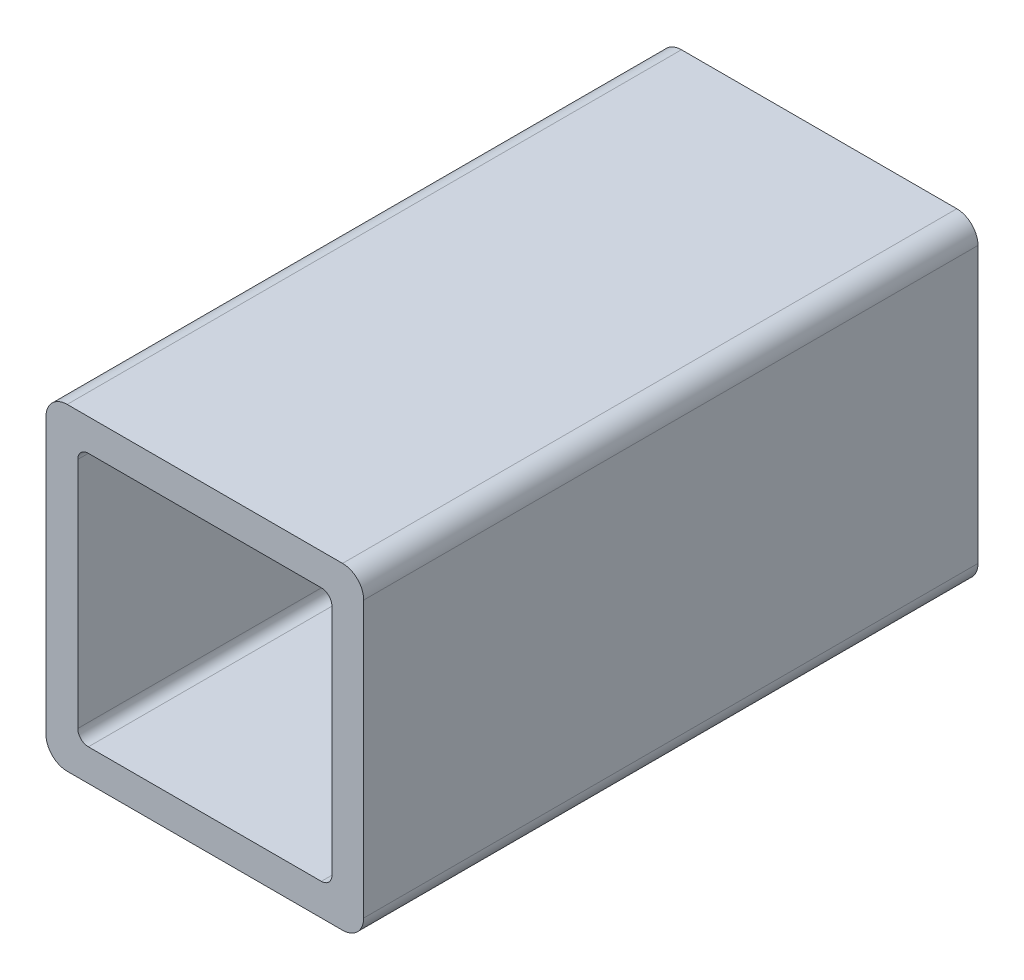
ISO-10303-21;
HEADER;
FILE_DESCRIPTION(('STEP AP214'),'2;1');
FILE_NAME('part.step','',(''),(''),'','','');
FILE_SCHEMA(('AUTOMOTIVE_DESIGN { 1 0 10303 214 1 1 1 1 }'));
ENDSEC;
DATA;
#1=APPLICATION_CONTEXT('core data for automotive mechanical design processes');
#2=APPLICATION_PROTOCOL_DEFINITION('international standard','automotive_design',2000,#1);
#3=PRODUCT_CONTEXT('',#1,'mechanical');
#4=PRODUCT('Part','Part','',(#3));
#5=PRODUCT_RELATED_PRODUCT_CATEGORY('part','',(#4));
#6=PRODUCT_DEFINITION_FORMATION('','',#4);
#7=PRODUCT_DEFINITION_CONTEXT('part definition',#1,'design');
#8=PRODUCT_DEFINITION('design','',#6,#7);
#9=PRODUCT_DEFINITION_SHAPE('','',#8);
#10=(LENGTH_UNIT() NAMED_UNIT(*) SI_UNIT(.MILLI.,.METRE.));
#11=(NAMED_UNIT(*) PLANE_ANGLE_UNIT() SI_UNIT($,.RADIAN.));
#12=(NAMED_UNIT(*) SI_UNIT($,.STERADIAN.) SOLID_ANGLE_UNIT());
#13=UNCERTAINTY_MEASURE_WITH_UNIT(LENGTH_MEASURE(1.E-05),#10,'distance_accuracy_value','');
#14=(GEOMETRIC_REPRESENTATION_CONTEXT(3) GLOBAL_UNCERTAINTY_ASSIGNED_CONTEXT((#13)) GLOBAL_UNIT_ASSIGNED_CONTEXT((#10,
#11,#12)) REPRESENTATION_CONTEXT('',''));
#15=CARTESIAN_POINT('',(0.,0.,0.));
#16=DIRECTION('',(0.,0.,1.));
#17=DIRECTION('',(1.,0.,0.));
#18=AXIS2_PLACEMENT_3D('',#15,#16,#17);
#19=CARTESIAN_POINT('',(2.,2.,58.));
#20=DIRECTION('',(0.,0.,1.));
#21=DIRECTION('',(1.,0.,0.));
#22=AXIS2_PLACEMENT_3D('',#19,#20,#21);
#23=PLANE('',#22);
#24=CARTESIAN_POINT('',(2.,2.,58.));
#25=DIRECTION('',(0.,0.,1.));
#26=DIRECTION('',(1.,0.,0.));
#27=AXIS2_PLACEMENT_3D('',#24,#25,#26);
#28=CIRCLE('',#27,2.);
#29=CARTESIAN_POINT('',(0.,2.00000000000001,58.));
#30=VERTEX_POINT('',#29);
#31=CARTESIAN_POINT('',(2.00000000000001,0.,58.));
#32=VERTEX_POINT('',#31);
#33=EDGE_CURVE('E214',#30,#32,#28,.T.);
#34=ORIENTED_EDGE('',*,*,#33,.T.);
#35=DIRECTION('',(1.,0.,0.));
#36=VECTOR('',#35,1.);
#37=CARTESIAN_POINT('',(2.00000000000001,0.,58.));
#38=LINE('',#37,#36);
#39=CARTESIAN_POINT('',(28.,0.,58.));
#40=VERTEX_POINT('',#39);
#41=EDGE_CURVE('E217',#32,#40,#38,.T.);
#42=ORIENTED_EDGE('',*,*,#41,.T.);
#43=CARTESIAN_POINT('',(28.,2.,58.));
#44=DIRECTION('',(0.,0.,1.));
#45=DIRECTION('',(1.,0.,0.));
#46=AXIS2_PLACEMENT_3D('',#43,#44,#45);
#47=CIRCLE('',#46,2.);
#48=CARTESIAN_POINT('',(30.,2.00000000000001,58.));
#49=VERTEX_POINT('',#48);
#50=EDGE_CURVE('E220',#40,#49,#47,.T.);
#51=ORIENTED_EDGE('',*,*,#50,.T.);
#52=DIRECTION('',(0.,1.,0.));
#53=VECTOR('',#52,1.);
#54=CARTESIAN_POINT('',(30.,2.00000000000001,58.));
#55=LINE('',#54,#53);
#56=CARTESIAN_POINT('',(30.,28.,58.));
#57=VERTEX_POINT('',#56);
#58=EDGE_CURVE('E222',#49,#57,#55,.T.);
#59=ORIENTED_EDGE('',*,*,#58,.T.);
#60=CARTESIAN_POINT('',(28.,28.,58.));
#61=DIRECTION('',(0.,0.,1.));
#62=DIRECTION('',(1.,0.,0.));
#63=AXIS2_PLACEMENT_3D('',#60,#61,#62);
#64=CIRCLE('',#63,2.);
#65=CARTESIAN_POINT('',(28.,30.,58.));
#66=VERTEX_POINT('',#65);
#67=EDGE_CURVE('E224',#57,#66,#64,.T.);
#68=ORIENTED_EDGE('',*,*,#67,.T.);
#69=DIRECTION('',(-1.,0.,0.));
#70=VECTOR('',#69,1.);
#71=CARTESIAN_POINT('',(2.00000000000001,30.,58.));
#72=LINE('',#71,#70);
#73=CARTESIAN_POINT('',(2.00000000000001,30.,58.));
#74=VERTEX_POINT('',#73);
#75=EDGE_CURVE('E226',#66,#74,#72,.T.);
#76=ORIENTED_EDGE('',*,*,#75,.T.);
#77=CARTESIAN_POINT('',(2.,28.,58.));
#78=DIRECTION('',(0.,0.,1.));
#79=DIRECTION('',(1.,0.,0.));
#80=AXIS2_PLACEMENT_3D('',#77,#78,#79);
#81=CIRCLE('',#80,2.);
#82=CARTESIAN_POINT('',(0.,28.,58.));
#83=VERTEX_POINT('',#82);
#84=EDGE_CURVE('E228',#74,#83,#81,.T.);
#85=ORIENTED_EDGE('',*,*,#84,.T.);
#86=DIRECTION('',(0.,-1.,0.));
#87=VECTOR('',#86,1.);
#88=CARTESIAN_POINT('',(0.,2.00000000000001,58.));
#89=LINE('',#88,#87);
#90=EDGE_CURVE('E230',#83,#30,#89,.T.);
#91=ORIENTED_EDGE('',*,*,#90,.T.);
#92=EDGE_LOOP('',(#34,#42,#51,#59,#68,#76,#85,#91));
#93=FACE_BOUND('',#92,.T.);
#94=DIRECTION('',(1.,0.,0.));
#95=VECTOR('',#94,1.);
#96=CARTESIAN_POINT('',(4.00000000000001,3.,58.));
#97=LINE('',#96,#95);
#98=CARTESIAN_POINT('',(4.00000000000001,3.,58.));
#99=VERTEX_POINT('',#98);
#100=CARTESIAN_POINT('',(26.,3.,58.));
#101=VERTEX_POINT('',#100);
#102=EDGE_CURVE('E157',#99,#101,#97,.T.);
#103=ORIENTED_EDGE('',*,*,#102,.F.);
#104=CARTESIAN_POINT('',(4.,4.,58.));
#105=DIRECTION('',(0.,0.,1.));
#106=DIRECTION('',(1.,0.,0.));
#107=AXIS2_PLACEMENT_3D('',#104,#105,#106);
#108=CIRCLE('',#107,1.);
#109=CARTESIAN_POINT('',(3.,4.00000000000001,58.));
#110=VERTEX_POINT('',#109);
#111=EDGE_CURVE('E149',#110,#99,#108,.T.);
#112=ORIENTED_EDGE('',*,*,#111,.F.);
#113=DIRECTION('',(0.,-1.,0.));
#114=VECTOR('',#113,1.);
#115=CARTESIAN_POINT('',(3.,4.00000000000001,58.));
#116=LINE('',#115,#114);
#117=CARTESIAN_POINT('',(3.,26.,58.));
#118=VERTEX_POINT('',#117);
#119=EDGE_CURVE('E182',#118,#110,#116,.T.);
#120=ORIENTED_EDGE('',*,*,#119,.F.);
#121=CARTESIAN_POINT('',(4.,26.,58.));
#122=DIRECTION('',(0.,0.,1.));
#123=DIRECTION('',(1.,0.,0.));
#124=AXIS2_PLACEMENT_3D('',#121,#122,#123);
#125=CIRCLE('',#124,1.);
#126=CARTESIAN_POINT('',(4.00000000000001,27.,58.));
#127=VERTEX_POINT('',#126);
#128=EDGE_CURVE('E180',#127,#118,#125,.T.);
#129=ORIENTED_EDGE('',*,*,#128,.F.);
#130=DIRECTION('',(-1.,0.,0.));
#131=VECTOR('',#130,1.);
#132=CARTESIAN_POINT('',(4.00000000000001,27.,58.));
#133=LINE('',#132,#131);
#134=CARTESIAN_POINT('',(26.,27.,58.));
#135=VERTEX_POINT('',#134);
#136=EDGE_CURVE('E178',#135,#127,#133,.T.);
#137=ORIENTED_EDGE('',*,*,#136,.F.);
#138=CARTESIAN_POINT('',(26.,26.,58.));
#139=DIRECTION('',(0.,0.,1.));
#140=DIRECTION('',(1.,0.,0.));
#141=AXIS2_PLACEMENT_3D('',#138,#139,#140);
#142=CIRCLE('',#141,1.);
#143=CARTESIAN_POINT('',(27.,26.,58.));
#144=VERTEX_POINT('',#143);
#145=EDGE_CURVE('E176',#144,#135,#142,.T.);
#146=ORIENTED_EDGE('',*,*,#145,.F.);
#147=DIRECTION('',(0.,1.,0.));
#148=VECTOR('',#147,1.);
#149=CARTESIAN_POINT('',(27.,4.00000000000001,58.));
#150=LINE('',#149,#148);
#151=CARTESIAN_POINT('',(27.,4.00000000000001,58.));
#152=VERTEX_POINT('',#151);
#153=EDGE_CURVE('E172',#152,#144,#150,.T.);
#154=ORIENTED_EDGE('',*,*,#153,.F.);
#155=CARTESIAN_POINT('',(26.,4.,58.));
#156=DIRECTION('',(0.,0.,1.));
#157=DIRECTION('',(1.,0.,0.));
#158=AXIS2_PLACEMENT_3D('',#155,#156,#157);
#159=CIRCLE('',#158,1.);
#160=EDGE_CURVE('E170',#101,#152,#159,.T.);
#161=ORIENTED_EDGE('',*,*,#160,.F.);
#162=EDGE_LOOP('',(#103,#112,#120,#129,#137,#146,#154,#161));
#163=FACE_BOUND('',#162,.T.);
#164=ADVANCED_FACE('F36',(#93,#163),#23,.T.);
#165=CARTESIAN_POINT('',(2.,2.,0.));
#166=DIRECTION('',(0.,0.,1.));
#167=DIRECTION('',(1.,0.,0.));
#168=AXIS2_PLACEMENT_3D('',#165,#166,#167);
#169=PLANE('',#168);
#170=CARTESIAN_POINT('',(2.,2.,0.));
#171=DIRECTION('',(0.,0.,1.));
#172=DIRECTION('',(1.,0.,0.));
#173=AXIS2_PLACEMENT_3D('',#170,#171,#172);
#174=CIRCLE('',#173,2.);
#175=CARTESIAN_POINT('',(0.,2.00000000000001,0.));
#176=VERTEX_POINT('',#175);
#177=CARTESIAN_POINT('',(2.00000000000001,0.,0.));
#178=VERTEX_POINT('',#177);
#179=EDGE_CURVE('E165',#176,#178,#174,.T.);
#180=ORIENTED_EDGE('',*,*,#179,.F.);
#181=DIRECTION('',(0.,-1.,0.));
#182=VECTOR('',#181,1.);
#183=CARTESIAN_POINT('',(0.,2.00000000000001,0.));
#184=LINE('',#183,#182);
#185=CARTESIAN_POINT('',(0.,28.,0.));
#186=VERTEX_POINT('',#185);
#187=EDGE_CURVE('E218',#186,#176,#184,.T.);
#188=ORIENTED_EDGE('',*,*,#187,.F.);
#189=CARTESIAN_POINT('',(2.,28.,0.));
#190=DIRECTION('',(0.,0.,1.));
#191=DIRECTION('',(1.,0.,0.));
#192=AXIS2_PLACEMENT_3D('',#189,#190,#191);
#193=CIRCLE('',#192,2.);
#194=CARTESIAN_POINT('',(2.00000000000001,30.,0.));
#195=VERTEX_POINT('',#194);
#196=EDGE_CURVE('E245',#195,#186,#193,.T.);
#197=ORIENTED_EDGE('',*,*,#196,.F.);
#198=DIRECTION('',(-1.,0.,0.));
#199=VECTOR('',#198,1.);
#200=CARTESIAN_POINT('',(2.00000000000001,30.,0.));
#201=LINE('',#200,#199);
#202=CARTESIAN_POINT('',(28.,30.,0.));
#203=VERTEX_POINT('',#202);
#204=EDGE_CURVE('E243',#203,#195,#201,.T.);
#205=ORIENTED_EDGE('',*,*,#204,.F.);
#206=CARTESIAN_POINT('',(28.,28.,0.));
#207=DIRECTION('',(0.,0.,1.));
#208=DIRECTION('',(1.,0.,0.));
#209=AXIS2_PLACEMENT_3D('',#206,#207,#208);
#210=CIRCLE('',#209,2.);
#211=CARTESIAN_POINT('',(30.,28.,0.));
#212=VERTEX_POINT('',#211);
#213=EDGE_CURVE('E241',#212,#203,#210,.T.);
#214=ORIENTED_EDGE('',*,*,#213,.F.);
#215=DIRECTION('',(0.,1.,0.));
#216=VECTOR('',#215,1.);
#217=CARTESIAN_POINT('',(30.,2.00000000000001,0.));
#218=LINE('',#217,#216);
#219=CARTESIAN_POINT('',(30.,2.00000000000001,0.));
#220=VERTEX_POINT('',#219);
#221=EDGE_CURVE('E239',#220,#212,#218,.T.);
#222=ORIENTED_EDGE('',*,*,#221,.F.);
#223=CARTESIAN_POINT('',(28.,2.,0.));
#224=DIRECTION('',(0.,0.,1.));
#225=DIRECTION('',(1.,0.,0.));
#226=AXIS2_PLACEMENT_3D('',#223,#224,#225);
#227=CIRCLE('',#226,2.);
#228=CARTESIAN_POINT('',(28.,0.,0.));
#229=VERTEX_POINT('',#228);
#230=EDGE_CURVE('E237',#229,#220,#227,.T.);
#231=ORIENTED_EDGE('',*,*,#230,.F.);
#232=DIRECTION('',(1.,0.,0.));
#233=VECTOR('',#232,1.);
#234=CARTESIAN_POINT('',(2.00000000000001,0.,0.));
#235=LINE('',#234,#233);
#236=EDGE_CURVE('E235',#178,#229,#235,.T.);
#237=ORIENTED_EDGE('',*,*,#236,.F.);
#238=EDGE_LOOP('',(#180,#188,#197,#205,#214,#222,#231,#237));
#239=FACE_BOUND('',#238,.T.);
#240=CARTESIAN_POINT('',(4.,4.,0.));
#241=DIRECTION('',(0.,0.,1.));
#242=DIRECTION('',(1.,0.,0.));
#243=AXIS2_PLACEMENT_3D('',#240,#241,#242);
#244=CIRCLE('',#243,1.);
#245=CARTESIAN_POINT('',(3.,4.00000000000001,0.));
#246=VERTEX_POINT('',#245);
#247=CARTESIAN_POINT('',(4.00000000000001,3.,0.));
#248=VERTEX_POINT('',#247);
#249=EDGE_CURVE('E59',#246,#248,#244,.T.);
#250=ORIENTED_EDGE('',*,*,#249,.T.);
#251=DIRECTION('',(1.,0.,0.));
#252=VECTOR('',#251,1.);
#253=CARTESIAN_POINT('',(4.00000000000001,3.,0.));
#254=LINE('',#253,#252);
#255=CARTESIAN_POINT('',(26.,3.,0.));
#256=VERTEX_POINT('',#255);
#257=EDGE_CURVE('E164',#248,#256,#254,.T.);
#258=ORIENTED_EDGE('',*,*,#257,.T.);
#259=CARTESIAN_POINT('',(26.,4.,0.));
#260=DIRECTION('',(0.,0.,1.));
#261=DIRECTION('',(1.,0.,0.));
#262=AXIS2_PLACEMENT_3D('',#259,#260,#261);
#263=CIRCLE('',#262,1.);
#264=CARTESIAN_POINT('',(27.,4.00000000000001,0.));
#265=VERTEX_POINT('',#264);
#266=EDGE_CURVE('E186',#256,#265,#263,.T.);
#267=ORIENTED_EDGE('',*,*,#266,.T.);
#268=DIRECTION('',(0.,1.,0.));
#269=VECTOR('',#268,1.);
#270=CARTESIAN_POINT('',(27.,4.00000000000001,0.));
#271=LINE('',#270,#269);
#272=CARTESIAN_POINT('',(27.,26.,0.));
#273=VERTEX_POINT('',#272);
#274=EDGE_CURVE('E189',#265,#273,#271,.T.);
#275=ORIENTED_EDGE('',*,*,#274,.T.);
#276=CARTESIAN_POINT('',(26.,26.,0.));
#277=DIRECTION('',(0.,0.,1.));
#278=DIRECTION('',(1.,0.,0.));
#279=AXIS2_PLACEMENT_3D('',#276,#277,#278);
#280=CIRCLE('',#279,1.);
#281=CARTESIAN_POINT('',(26.,27.,0.));
#282=VERTEX_POINT('',#281);
#283=EDGE_CURVE('E192',#273,#282,#280,.T.);
#284=ORIENTED_EDGE('',*,*,#283,.T.);
#285=DIRECTION('',(-1.,0.,0.));
#286=VECTOR('',#285,1.);
#287=CARTESIAN_POINT('',(4.00000000000001,27.,0.));
#288=LINE('',#287,#286);
#289=CARTESIAN_POINT('',(4.00000000000001,27.,0.));
#290=VERTEX_POINT('',#289);
#291=EDGE_CURVE('E195',#282,#290,#288,.T.);
#292=ORIENTED_EDGE('',*,*,#291,.T.);
#293=CARTESIAN_POINT('',(4.,26.,0.));
#294=DIRECTION('',(0.,0.,1.));
#295=DIRECTION('',(1.,0.,0.));
#296=AXIS2_PLACEMENT_3D('',#293,#294,#295);
#297=CIRCLE('',#296,1.);
#298=CARTESIAN_POINT('',(3.,26.,0.));
#299=VERTEX_POINT('',#298);
#300=EDGE_CURVE('E198',#290,#299,#297,.T.);
#301=ORIENTED_EDGE('',*,*,#300,.T.);
#302=DIRECTION('',(0.,-1.,0.));
#303=VECTOR('',#302,1.);
#304=CARTESIAN_POINT('',(3.,4.00000000000001,0.));
#305=LINE('',#304,#303);
#306=EDGE_CURVE('E158',#299,#246,#305,.T.);
#307=ORIENTED_EDGE('',*,*,#306,.T.);
#308=EDGE_LOOP('',(#250,#258,#267,#275,#284,#292,#301,#307));
#309=FACE_BOUND('',#308,.T.);
#310=ADVANCED_FACE('F275',(#239,#309),#169,.F.);
#311=CARTESIAN_POINT('',(2.,2.,58.));
#312=DIRECTION('',(0.,0.,-1.));
#313=DIRECTION('',(-1.,0.,0.));
#314=AXIS2_PLACEMENT_3D('',#311,#312,#313);
#315=CYLINDRICAL_SURFACE('',#314,2.);
#316=ORIENTED_EDGE('',*,*,#179,.T.);
#317=DIRECTION('',(0.,0.,-1.));
#318=VECTOR('',#317,1.);
#319=CARTESIAN_POINT('',(2.00000000000001,0.,58.));
#320=LINE('',#319,#318);
#321=EDGE_CURVE('E11',#32,#178,#320,.T.);
#322=ORIENTED_EDGE('',*,*,#321,.F.);
#323=ORIENTED_EDGE('',*,*,#33,.F.);
#324=DIRECTION('',(0.,0.,-1.));
#325=VECTOR('',#324,1.);
#326=CARTESIAN_POINT('',(0.,2.00000000000001,58.));
#327=LINE('',#326,#325);
#328=EDGE_CURVE('E232',#30,#176,#327,.T.);
#329=ORIENTED_EDGE('',*,*,#328,.T.);
#330=EDGE_LOOP('',(#316,#322,#323,#329));
#331=FACE_BOUND('',#330,.T.);
#332=ADVANCED_FACE('F38',(#331),#315,.T.);
#333=CARTESIAN_POINT('',(2.00000000000001,0.,58.));
#334=DIRECTION('',(0.,1.,0.));
#335=DIRECTION('',(0.,0.,1.));
#336=AXIS2_PLACEMENT_3D('',#333,#334,#335);
#337=PLANE('',#336);
#338=ORIENTED_EDGE('',*,*,#236,.T.);
#339=DIRECTION('',(0.,0.,-1.));
#340=VECTOR('',#339,1.);
#341=CARTESIAN_POINT('',(28.,0.,58.));
#342=LINE('',#341,#340);
#343=EDGE_CURVE('E44',#40,#229,#342,.T.);
#344=ORIENTED_EDGE('',*,*,#343,.F.);
#345=ORIENTED_EDGE('',*,*,#41,.F.);
#346=ORIENTED_EDGE('',*,*,#321,.T.);
#347=EDGE_LOOP('',(#338,#344,#345,#346));
#348=FACE_BOUND('',#347,.T.);
#349=ADVANCED_FACE('F292',(#348),#337,.F.);
#350=CARTESIAN_POINT('',(28.,2.,58.));
#351=DIRECTION('',(0.,0.,-1.));
#352=DIRECTION('',(-1.,0.,0.));
#353=AXIS2_PLACEMENT_3D('',#350,#351,#352);
#354=CYLINDRICAL_SURFACE('',#353,2.);
#355=ORIENTED_EDGE('',*,*,#230,.T.);
#356=DIRECTION('',(0.,0.,-1.));
#357=VECTOR('',#356,1.);
#358=CARTESIAN_POINT('',(30.,2.00000000000001,58.));
#359=LINE('',#358,#357);
#360=EDGE_CURVE('E262',#49,#220,#359,.T.);
#361=ORIENTED_EDGE('',*,*,#360,.F.);
#362=ORIENTED_EDGE('',*,*,#50,.F.);
#363=ORIENTED_EDGE('',*,*,#343,.T.);
#364=EDGE_LOOP('',(#355,#361,#362,#363));
#365=FACE_BOUND('',#364,.T.);
#366=ADVANCED_FACE('F269',(#365),#354,.T.);
#367=CARTESIAN_POINT('',(30.,2.00000000000001,58.));
#368=DIRECTION('',(-1.,0.,0.));
#369=DIRECTION('',(0.,0.,1.));
#370=AXIS2_PLACEMENT_3D('',#367,#368,#369);
#371=PLANE('',#370);
#372=ORIENTED_EDGE('',*,*,#221,.T.);
#373=DIRECTION('',(0.,0.,-1.));
#374=VECTOR('',#373,1.);
#375=CARTESIAN_POINT('',(30.,28.,58.));
#376=LINE('',#375,#374);
#377=EDGE_CURVE('E259',#57,#212,#376,.T.);
#378=ORIENTED_EDGE('',*,*,#377,.F.);
#379=ORIENTED_EDGE('',*,*,#58,.F.);
#380=ORIENTED_EDGE('',*,*,#360,.T.);
#381=EDGE_LOOP('',(#372,#378,#379,#380));
#382=FACE_BOUND('',#381,.T.);
#383=ADVANCED_FACE('F281',(#382),#371,.F.);
#384=CARTESIAN_POINT('',(28.,28.,58.));
#385=DIRECTION('',(0.,0.,-1.));
#386=DIRECTION('',(-1.,0.,0.));
#387=AXIS2_PLACEMENT_3D('',#384,#385,#386);
#388=CYLINDRICAL_SURFACE('',#387,2.);
#389=ORIENTED_EDGE('',*,*,#213,.T.);
#390=DIRECTION('',(0.,0.,-1.));
#391=VECTOR('',#390,1.);
#392=CARTESIAN_POINT('',(28.,30.,58.));
#393=LINE('',#392,#391);
#394=EDGE_CURVE('E256',#66,#203,#393,.T.);
#395=ORIENTED_EDGE('',*,*,#394,.F.);
#396=ORIENTED_EDGE('',*,*,#67,.F.);
#397=ORIENTED_EDGE('',*,*,#377,.T.);
#398=EDGE_LOOP('',(#389,#395,#396,#397));
#399=FACE_BOUND('',#398,.T.);
#400=ADVANCED_FACE('F285',(#399),#388,.T.);
#401=CARTESIAN_POINT('',(2.00000000000001,30.,58.));
#402=DIRECTION('',(0.,-1.,0.));
#403=DIRECTION('',(0.,0.,-1.));
#404=AXIS2_PLACEMENT_3D('',#401,#402,#403);
#405=PLANE('',#404);
#406=ORIENTED_EDGE('',*,*,#204,.T.);
#407=DIRECTION('',(0.,0.,-1.));
#408=VECTOR('',#407,1.);
#409=CARTESIAN_POINT('',(2.00000000000001,30.,58.));
#410=LINE('',#409,#408);
#411=EDGE_CURVE('E253',#74,#195,#410,.T.);
#412=ORIENTED_EDGE('',*,*,#411,.F.);
#413=ORIENTED_EDGE('',*,*,#75,.F.);
#414=ORIENTED_EDGE('',*,*,#394,.T.);
#415=EDGE_LOOP('',(#406,#412,#413,#414));
#416=FACE_BOUND('',#415,.T.);
#417=ADVANCED_FACE('F305',(#416),#405,.F.);
#418=CARTESIAN_POINT('',(2.,28.,58.));
#419=DIRECTION('',(0.,0.,-1.));
#420=DIRECTION('',(-1.,0.,0.));
#421=AXIS2_PLACEMENT_3D('',#418,#419,#420);
#422=CYLINDRICAL_SURFACE('',#421,2.);
#423=ORIENTED_EDGE('',*,*,#196,.T.);
#424=DIRECTION('',(0.,0.,-1.));
#425=VECTOR('',#424,1.);
#426=CARTESIAN_POINT('',(0.,28.,58.));
#427=LINE('',#426,#425);
#428=EDGE_CURVE('E250',#83,#186,#427,.T.);
#429=ORIENTED_EDGE('',*,*,#428,.F.);
#430=ORIENTED_EDGE('',*,*,#84,.F.);
#431=ORIENTED_EDGE('',*,*,#411,.T.);
#432=EDGE_LOOP('',(#423,#429,#430,#431));
#433=FACE_BOUND('',#432,.T.);
#434=ADVANCED_FACE('F303',(#433),#422,.T.);
#435=CARTESIAN_POINT('',(0.,2.00000000000001,58.));
#436=DIRECTION('',(1.,0.,0.));
#437=DIRECTION('',(0.,0.,-1.));
#438=AXIS2_PLACEMENT_3D('',#435,#436,#437);
#439=PLANE('',#438);
#440=ORIENTED_EDGE('',*,*,#187,.T.);
#441=ORIENTED_EDGE('',*,*,#328,.F.);
#442=ORIENTED_EDGE('',*,*,#90,.F.);
#443=ORIENTED_EDGE('',*,*,#428,.T.);
#444=EDGE_LOOP('',(#440,#441,#442,#443));
#445=FACE_BOUND('',#444,.T.);
#446=ADVANCED_FACE('F298',(#445),#439,.F.);
#447=CARTESIAN_POINT('',(4.,4.,58.));
#448=DIRECTION('',(0.,0.,-1.));
#449=DIRECTION('',(-1.,0.,0.));
#450=AXIS2_PLACEMENT_3D('',#447,#448,#449);
#451=CYLINDRICAL_SURFACE('',#450,1.);
#452=ORIENTED_EDGE('',*,*,#249,.F.);
#453=DIRECTION('',(0.,0.,-1.));
#454=VECTOR('',#453,1.);
#455=CARTESIAN_POINT('',(3.,4.00000000000001,58.));
#456=LINE('',#455,#454);
#457=EDGE_CURVE('E153',#110,#246,#456,.T.);
#458=ORIENTED_EDGE('',*,*,#457,.F.);
#459=ORIENTED_EDGE('',*,*,#111,.T.);
#460=DIRECTION('',(0.,0.,-1.));
#461=VECTOR('',#460,1.);
#462=CARTESIAN_POINT('',(4.00000000000001,3.,58.));
#463=LINE('',#462,#461);
#464=EDGE_CURVE('E152',#99,#248,#463,.T.);
#465=ORIENTED_EDGE('',*,*,#464,.T.);
#466=EDGE_LOOP('',(#452,#458,#459,#465));
#467=FACE_BOUND('',#466,.T.);
#468=ADVANCED_FACE('F151',(#467),#451,.F.);
#469=CARTESIAN_POINT('',(4.00000000000001,3.,58.));
#470=DIRECTION('',(0.,1.,0.));
#471=DIRECTION('',(-1.,0.,0.));
#472=AXIS2_PLACEMENT_3D('',#469,#470,#471);
#473=PLANE('',#472);
#474=ORIENTED_EDGE('',*,*,#257,.F.);
#475=ORIENTED_EDGE('',*,*,#464,.F.);
#476=ORIENTED_EDGE('',*,*,#102,.T.);
#477=DIRECTION('',(0.,0.,-1.));
#478=VECTOR('',#477,1.);
#479=CARTESIAN_POINT('',(26.,3.,58.));
#480=LINE('',#479,#478);
#481=EDGE_CURVE('E166',#101,#256,#480,.T.);
#482=ORIENTED_EDGE('',*,*,#481,.T.);
#483=EDGE_LOOP('',(#474,#475,#476,#482));
#484=FACE_BOUND('',#483,.T.);
#485=ADVANCED_FACE('F161',(#484),#473,.T.);
#486=CARTESIAN_POINT('',(26.,4.,58.));
#487=DIRECTION('',(0.,0.,-1.));
#488=DIRECTION('',(-1.,0.,0.));
#489=AXIS2_PLACEMENT_3D('',#486,#487,#488);
#490=CYLINDRICAL_SURFACE('',#489,1.);
#491=ORIENTED_EDGE('',*,*,#266,.F.);
#492=ORIENTED_EDGE('',*,*,#481,.F.);
#493=ORIENTED_EDGE('',*,*,#160,.T.);
#494=DIRECTION('',(0.,0.,-1.));
#495=VECTOR('',#494,1.);
#496=CARTESIAN_POINT('',(27.,4.00000000000001,58.));
#497=LINE('',#496,#495);
#498=EDGE_CURVE('E211',#152,#265,#497,.T.);
#499=ORIENTED_EDGE('',*,*,#498,.T.);
#500=EDGE_LOOP('',(#491,#492,#493,#499));
#501=FACE_BOUND('',#500,.T.);
#502=ADVANCED_FACE('F330',(#501),#490,.F.);
#503=CARTESIAN_POINT('',(27.,4.00000000000001,58.));
#504=DIRECTION('',(-1.,0.,0.));
#505=DIRECTION('',(0.,0.,1.));
#506=AXIS2_PLACEMENT_3D('',#503,#504,#505);
#507=PLANE('',#506);
#508=ORIENTED_EDGE('',*,*,#274,.F.);
#509=ORIENTED_EDGE('',*,*,#498,.F.);
#510=ORIENTED_EDGE('',*,*,#153,.T.);
#511=DIRECTION('',(0.,0.,-1.));
#512=VECTOR('',#511,1.);
#513=CARTESIAN_POINT('',(27.,26.,58.));
#514=LINE('',#513,#512);
#515=EDGE_CURVE('E209',#144,#273,#514,.T.);
#516=ORIENTED_EDGE('',*,*,#515,.T.);
#517=EDGE_LOOP('',(#508,#509,#510,#516));
#518=FACE_BOUND('',#517,.T.);
#519=ADVANCED_FACE('F334',(#518),#507,.T.);
#520=CARTESIAN_POINT('',(26.,26.,58.));
#521=DIRECTION('',(0.,0.,-1.));
#522=DIRECTION('',(-1.,0.,0.));
#523=AXIS2_PLACEMENT_3D('',#520,#521,#522);
#524=CYLINDRICAL_SURFACE('',#523,1.);
#525=ORIENTED_EDGE('',*,*,#283,.F.);
#526=ORIENTED_EDGE('',*,*,#515,.F.);
#527=ORIENTED_EDGE('',*,*,#145,.T.);
#528=DIRECTION('',(0.,0.,-1.));
#529=VECTOR('',#528,1.);
#530=CARTESIAN_POINT('',(26.,27.,58.));
#531=LINE('',#530,#529);
#532=EDGE_CURVE('E207',#135,#282,#531,.T.);
#533=ORIENTED_EDGE('',*,*,#532,.T.);
#534=EDGE_LOOP('',(#525,#526,#527,#533));
#535=FACE_BOUND('',#534,.T.);
#536=ADVANCED_FACE('F340',(#535),#524,.F.);
#537=CARTESIAN_POINT('',(4.00000000000001,27.,58.));
#538=DIRECTION('',(0.,-1.,0.));
#539=DIRECTION('',(0.,0.,-1.));
#540=AXIS2_PLACEMENT_3D('',#537,#538,#539);
#541=PLANE('',#540);
#542=ORIENTED_EDGE('',*,*,#291,.F.);
#543=ORIENTED_EDGE('',*,*,#532,.F.);
#544=ORIENTED_EDGE('',*,*,#136,.T.);
#545=DIRECTION('',(0.,0.,-1.));
#546=VECTOR('',#545,1.);
#547=CARTESIAN_POINT('',(4.00000000000001,27.,58.));
#548=LINE('',#547,#546);
#549=EDGE_CURVE('E205',#127,#290,#548,.T.);
#550=ORIENTED_EDGE('',*,*,#549,.T.);
#551=EDGE_LOOP('',(#542,#543,#544,#550));
#552=FACE_BOUND('',#551,.T.);
#553=ADVANCED_FACE('F344',(#552),#541,.T.);
#554=CARTESIAN_POINT('',(4.,26.,58.));
#555=DIRECTION('',(0.,0.,-1.));
#556=DIRECTION('',(-1.,0.,0.));
#557=AXIS2_PLACEMENT_3D('',#554,#555,#556);
#558=CYLINDRICAL_SURFACE('',#557,1.);
#559=ORIENTED_EDGE('',*,*,#300,.F.);
#560=ORIENTED_EDGE('',*,*,#549,.F.);
#561=ORIENTED_EDGE('',*,*,#128,.T.);
#562=DIRECTION('',(0.,0.,-1.));
#563=VECTOR('',#562,1.);
#564=CARTESIAN_POINT('',(3.,26.,58.));
#565=LINE('',#564,#563);
#566=EDGE_CURVE('E51',#118,#299,#565,.T.);
#567=ORIENTED_EDGE('',*,*,#566,.T.);
#568=EDGE_LOOP('',(#559,#560,#561,#567));
#569=FACE_BOUND('',#568,.T.);
#570=ADVANCED_FACE('F348',(#569),#558,.F.);
#571=CARTESIAN_POINT('',(3.,4.00000000000001,58.));
#572=DIRECTION('',(1.,0.,0.));
#573=DIRECTION('',(0.,0.,-1.));
#574=AXIS2_PLACEMENT_3D('',#571,#572,#573);
#575=PLANE('',#574);
#576=ORIENTED_EDGE('',*,*,#306,.F.);
#577=ORIENTED_EDGE('',*,*,#566,.F.);
#578=ORIENTED_EDGE('',*,*,#119,.T.);
#579=ORIENTED_EDGE('',*,*,#457,.T.);
#580=EDGE_LOOP('',(#576,#577,#578,#579));
#581=FACE_BOUND('',#580,.T.);
#582=ADVANCED_FACE('F352',(#581),#575,.T.);
#583=CLOSED_SHELL('',(#164,#310,#332,#349,#366,#383,#400,#417,#434,#446,#468,#485,#502,#519,
#536,#553,#570,#582));
#584=MANIFOLD_SOLID_BREP('B2',#583);
#585=ADVANCED_BREP_SHAPE_REPRESENTATION('',(#18,#584),#14);
#586=SHAPE_DEFINITION_REPRESENTATION(#9,#585);
ENDSEC;
END-ISO-10303-21;
